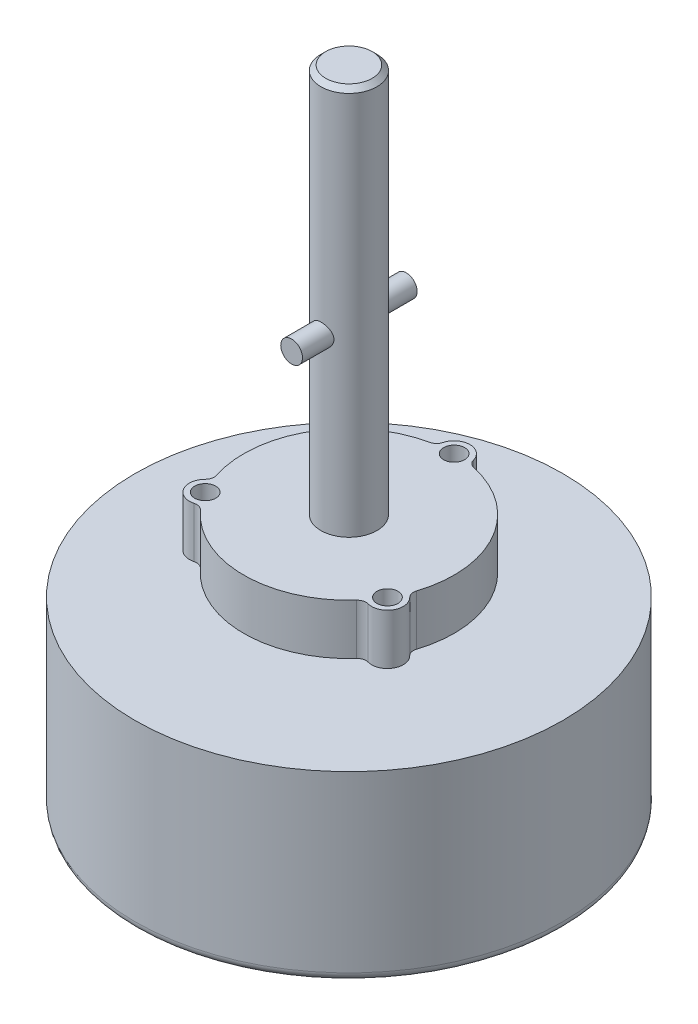
ISO-10303-21;
HEADER;
FILE_DESCRIPTION(('STEP AP214'),'2;1');
FILE_NAME('part.step','',(''),(''),'','','');
FILE_SCHEMA(('AUTOMOTIVE_DESIGN { 1 0 10303 214 1 1 1 1 }'));
ENDSEC;
DATA;
#1=APPLICATION_CONTEXT('core data for automotive mechanical design processes');
#2=APPLICATION_PROTOCOL_DEFINITION('international standard','automotive_design',2000,#1);
#3=PRODUCT_CONTEXT('',#1,'mechanical');
#4=PRODUCT('Part','Part','',(#3));
#5=PRODUCT_RELATED_PRODUCT_CATEGORY('part','',(#4));
#6=PRODUCT_DEFINITION_FORMATION('','',#4);
#7=PRODUCT_DEFINITION_CONTEXT('part definition',#1,'design');
#8=PRODUCT_DEFINITION('design','',#6,#7);
#9=PRODUCT_DEFINITION_SHAPE('','',#8);
#10=(LENGTH_UNIT() NAMED_UNIT(*) SI_UNIT(.MILLI.,.METRE.));
#11=(NAMED_UNIT(*) PLANE_ANGLE_UNIT() SI_UNIT($,.RADIAN.));
#12=(NAMED_UNIT(*) SI_UNIT($,.STERADIAN.) SOLID_ANGLE_UNIT());
#13=UNCERTAINTY_MEASURE_WITH_UNIT(LENGTH_MEASURE(1.E-05),#10,'distance_accuracy_value','');
#14=(GEOMETRIC_REPRESENTATION_CONTEXT(3) GLOBAL_UNCERTAINTY_ASSIGNED_CONTEXT((#13)) GLOBAL_UNIT_ASSIGNED_CONTEXT((#10,
#11,#12)) REPRESENTATION_CONTEXT('',''));
#15=CARTESIAN_POINT('',(0.,0.,0.));
#16=DIRECTION('',(0.,0.,1.));
#17=DIRECTION('',(1.,0.,0.));
#18=AXIS2_PLACEMENT_3D('',#15,#16,#17);
#19=CARTESIAN_POINT('',(0.,91.8,0.));
#20=DIRECTION('',(0.,-1.,0.));
#21=DIRECTION('',(0.,0.,-1.));
#22=AXIS2_PLACEMENT_3D('',#19,#20,#21);
#23=CYLINDRICAL_SURFACE('',#22,4.);
#24=CARTESIAN_POINT('',(0.,91.1095,0.));
#25=DIRECTION('',(0.,-1.,0.));
#26=DIRECTION('',(0.,0.,-1.));
#27=AXIS2_PLACEMENT_3D('',#24,#25,#26);
#28=CIRCLE('',#27,4.);
#29=CARTESIAN_POINT('',(0.,91.1095,-4.));
#30=VERTEX_POINT('',#29);
#31=EDGE_CURVE('E334',#30,#30,#28,.T.);
#32=ORIENTED_EDGE('',*,*,#31,.T.);
#33=EDGE_LOOP('',(#32));
#34=FACE_BOUND('',#33,.T.);
#35=CARTESIAN_POINT('',(0.,36.3,0.));
#36=DIRECTION('',(0.,1.,0.));
#37=DIRECTION('',(0.,0.,1.));
#38=AXIS2_PLACEMENT_3D('',#35,#36,#37);
#39=CIRCLE('',#38,4.);
#40=CARTESIAN_POINT('',(0.,36.3,4.));
#41=VERTEX_POINT('',#40);
#42=EDGE_CURVE('E338',#41,#41,#39,.T.);
#43=ORIENTED_EDGE('',*,*,#42,.T.);
#44=EDGE_LOOP('',(#43));
#45=FACE_BOUND('',#44,.T.);
#46=CARTESIAN_POINT('',(-1.54999999999999,60.5,3.68747881349846));
#47=CARTESIAN_POINT('',(-1.55000422788373,60.416525921829,3.68747472117894));
#48=CARTESIAN_POINT('',(-1.5432346121373,60.3330785285134,3.6903438930156));
#49=CARTESIAN_POINT('',(-1.51646936648417,60.1687131177776,3.70142257969848));
#50=CARTESIAN_POINT('',(-1.49647479481401,60.0877948985202,3.70963166725364));
#51=CARTESIAN_POINT('',(-1.44411451282104,59.9309128219059,3.73032361331672));
#52=CARTESIAN_POINT('',(-1.41178026764899,59.8549369340485,3.74279559342631));
#53=CARTESIAN_POINT('',(-1.33577095631088,59.7094578714103,3.77058994643585));
#54=CARTESIAN_POINT('',(-1.29209225249877,59.6399567825298,3.78591323317096));
#55=CARTESIAN_POINT('',(-1.19214782916111,59.5057059269305,3.81859574425636));
#56=CARTESIAN_POINT('',(-1.13537565240198,59.441348338556,3.83601758351888));
#57=CARTESIAN_POINT('',(-1.01192840493647,59.3227882295189,3.87041383992));
#58=CARTESIAN_POINT('',(-0.945251039434404,59.2685880686878,3.88738815230142));
#59=CARTESIAN_POINT('',(-0.800873934131544,59.1699558673267,3.91972744987039));
#60=CARTESIAN_POINT('',(-0.722859576800982,59.1259551019882,3.9350105551812));
#61=CARTESIAN_POINT('',(-0.559838200580591,59.0518672958997,3.96148780955261));
#62=CARTESIAN_POINT('',(-0.474833798635098,59.0217750757293,3.9726834804112));
#63=CARTESIAN_POINT('',(-0.304371809860816,58.9777490258691,3.9892795157892));
#64=CARTESIAN_POINT('',(-0.219112887243238,58.9631389160219,3.99492158898682));
#65=CARTESIAN_POINT('',(-0.0471791174832273,58.948319587997,4.00064521862469));
#66=CARTESIAN_POINT('',(0.0394952274914372,58.9481053688497,4.00072870605467));
#67=CARTESIAN_POINT('',(0.20693211546229,58.9617014843574,3.99547620694104));
#68=CARTESIAN_POINT('',(0.287765261327417,58.9747723258973,3.99042597894108));
#69=CARTESIAN_POINT('',(0.445987107299915,59.0133167421809,3.97585342004095));
#70=CARTESIAN_POINT('',(0.523375561512841,59.0387912007945,3.96633077044199));
#71=CARTESIAN_POINT('',(0.673879962455661,59.1017366918706,3.94357318810999));
#72=CARTESIAN_POINT('',(0.746915421508994,59.1393802130741,3.93028524095594));
#73=CARTESIAN_POINT('',(0.885818179827671,59.2254383908002,3.90132895999014));
#74=CARTESIAN_POINT('',(0.951683076195868,59.2738566415526,3.88565983241961));
#75=CARTESIAN_POINT('',(1.07871198096843,59.3835974553242,3.85239624089518));
#76=CARTESIAN_POINT('',(1.13933054451892,59.4455343973705,3.83474263937625));
#77=CARTESIAN_POINT('',(1.24953496591409,59.5787830435167,3.80026368534951));
#78=CARTESIAN_POINT('',(1.29911765354162,59.6500974320907,3.7834385719152));
#79=CARTESIAN_POINT('',(1.38698453142152,59.8023691854516,3.75213418417414));
#80=CARTESIAN_POINT('',(1.42495398841721,59.8835236176725,3.73772436806226));
#81=CARTESIAN_POINT('',(1.48647592246951,60.0517811737052,3.71368998675952));
#82=CARTESIAN_POINT('',(1.51003707917727,60.1388806809398,3.70406254129583));
#83=CARTESIAN_POINT('',(1.54079047650637,60.311138786207,3.69137199346917));
#84=CARTESIAN_POINT('',(1.54885502308291,60.3961156535372,3.68795967959354));
#85=CARTESIAN_POINT('',(1.5509166278898,60.5662583663023,3.68709392768971));
#86=CARTESIAN_POINT('',(1.54491755702697,60.6514241532921,3.68963884997596));
#87=CARTESIAN_POINT('',(1.51981486007012,60.8148740203653,3.7000442847608));
#88=CARTESIAN_POINT('',(1.50140958722697,60.8932855607083,3.70762122264295));
#89=CARTESIAN_POINT('',(1.45290900726717,61.0458638649204,3.72689299469388));
#90=CARTESIAN_POINT('',(1.42281120758889,61.1200297198423,3.73858870683515));
#91=CARTESIAN_POINT('',(1.35046181384096,61.2652379582138,3.76534082708802));
#92=CARTESIAN_POINT('',(1.30778133935865,61.3360451188958,3.78051067823169));
#93=CARTESIAN_POINT('',(1.21192549510613,61.469800243298,3.81231998402217));
#94=CARTESIAN_POINT('',(1.15874606517804,61.5327451511026,3.82896000583387));
#95=CARTESIAN_POINT('',(1.03909602838026,61.6534665050848,3.86321173888136));
#96=CARTESIAN_POINT('',(0.971964484409353,61.7105935063539,3.88081192676452));
#97=CARTESIAN_POINT('',(0.828640910393741,61.8128605178356,3.9139183579811));
#98=CARTESIAN_POINT('',(0.752448693612053,61.8580002809337,3.92942455814418));
#99=CARTESIAN_POINT('',(0.593068303299288,61.9347732613715,3.95661272739703));
#100=CARTESIAN_POINT('',(0.50989434345722,61.9664331597324,3.96830224014897));
#101=CARTESIAN_POINT('',(0.338840630357634,62.0151182742924,3.98654841604512));
#102=CARTESIAN_POINT('',(0.250963282170565,62.0321508955935,3.99310767624442));
#103=CARTESIAN_POINT('',(0.0788476448584613,62.0502596375884,4.00009281057401));
#104=CARTESIAN_POINT('',(-0.00528025254627414,62.0522561676002,4.00087242650867));
#105=CARTESIAN_POINT('',(-0.172625822578382,62.0426346913928,3.9971491681954));
#106=CARTESIAN_POINT('',(-0.255843616385901,62.0310185205385,3.9926470060757));
#107=CARTESIAN_POINT('',(-0.416676309706189,61.9951542995088,3.97903546809472));
#108=CARTESIAN_POINT('',(-0.494382292579291,61.9712616027342,3.97005589977893));
#109=CARTESIAN_POINT('',(-0.644679171385821,61.9118858063891,3.94843757966925));
#110=CARTESIAN_POINT('',(-0.717269096200015,61.8764005135019,3.93579813547908));
#111=CARTESIAN_POINT('',(-0.858715328241309,61.7931097823264,3.90743351237822));
#112=CARTESIAN_POINT('',(-0.927274668161894,61.7448381484434,3.89159857716547));
#113=CARTESIAN_POINT('',(-1.05559736841888,61.6380631274072,3.8587703490469));
#114=CARTESIAN_POINT('',(-1.1153574984023,61.5795559997771,3.84177663406475));
#115=CARTESIAN_POINT('',(-1.22791662351865,61.4499978306871,3.8073460300892));
#116=CARTESIAN_POINT('',(-1.28012164141038,61.3784205868488,3.78993942214949));
#117=CARTESIAN_POINT('',(-1.3718088227558,61.226965601563,3.75772676186843));
#118=CARTESIAN_POINT('',(-1.41128794316141,61.1470858808366,3.74292133191169));
#119=CARTESIAN_POINT('',(-1.4785202154391,60.9749879598794,3.71690557840244));
#120=CARTESIAN_POINT('',(-1.50520523660946,60.8822946628194,3.70603717202568));
#121=CARTESIAN_POINT('',(-1.54093566643026,60.6930536008389,3.69132895169951));
#122=CARTESIAN_POINT('',(-1.54999511191143,60.596508965674,3.68748354485378));
#123=CARTESIAN_POINT('',(-1.54999999999999,60.5,3.68747881349846));
#124=B_SPLINE_CURVE_WITH_KNOTS('',3,(#46,#47,#48,#49,#50,#51,#52,#53,#54,#55,#56,#57,#58,#59,
#60,#61,#62,#63,#64,#65,#66,#67,#68,#69,#70,#71,#72,#73,#74,#75,#76,#77,#78,#79,#80,#81,#82,#83,
#84,#85,#86,#87,#88,#89,#90,#91,#92,#93,#94,#95,#96,#97,#98,#99,#100,#101,#102,#103,#104,#105,
#106,#107,#108,#109,#110,#111,#112,#113,#114,#115,#116,#117,#118,#119,#120,#121,#122,#123),
.UNSPECIFIED.,.T.,.F.,(4,2,2,2,2,2,2,2,2,2,2,2,2,2,2,2,2,2,2,2,2,2,2,2,2,2,2,2,2,2,2,2,2,2,2,2,
2,2,4),(0.,0.250062254044811,0.500104500990466,0.749513375495774,0.999002322902403,
1.2605535750421,1.52216551713547,1.79337449738837,2.0644824002558,2.32318673856189,
2.58180120544244,2.82676832941063,3.07175291205883,3.32037458532182,3.56907931835032,
3.83321930090065,4.09743506388207,4.3682807909715,4.63896319774304,4.89390296549874,
5.14877257120582,5.39037605700663,5.63203107506653,5.88312693589144,6.13432009143505,
6.40272092598805,6.67112729313817,6.93899989911214,7.20673681371709,7.45794016491039,
7.70910965090945,7.95338726967235,8.19771113250197,8.45259478665547,8.70757178125691,
8.97713853669457,9.24676970386595,9.53611093061202,9.82522163444681),.UNSPECIFIED.);
#125=CARTESIAN_POINT('',(-1.54999999999999,60.5,3.68747881349846));
#126=VERTEX_POINT('',#125);
#127=EDGE_CURVE('E104',#126,#126,#124,.T.);
#128=ORIENTED_EDGE('',*,*,#127,.F.);
#129=EDGE_LOOP('',(#128));
#130=FACE_BOUND('',#129,.T.);
#131=CARTESIAN_POINT('',(0.,62.05,-4.));
#132=CARTESIAN_POINT('',(0.0837418170105696,62.0500040087332,-4.00000307103966));
#133=CARTESIAN_POINT('',(0.167457172373492,62.0431926629836,-3.9973478314409));
#134=CARTESIAN_POINT('',(0.332375207740034,62.0162464348654,-3.98702237503302));
#135=CARTESIAN_POINT('',(0.413578428549004,61.9961144413173,-3.97935324557983));
#136=CARTESIAN_POINT('',(0.571068953775959,61.9433531193091,-3.95981985493208));
#137=CARTESIAN_POINT('',(0.647365774547914,61.9107488916196,-3.94796402326925));
#138=CARTESIAN_POINT('',(0.793397990414405,61.8341007902612,-3.92122905980691));
#139=CARTESIAN_POINT('',(0.863131499694841,61.7900536423235,-3.9063490629407));
#140=CARTESIAN_POINT('',(0.99718845770088,61.689708587972,-3.8743461117322));
#141=CARTESIAN_POINT('',(1.06117882783834,61.6329870956487,-3.85715676295881));
#142=CARTESIAN_POINT('',(1.17901131840264,61.5098027006004,-3.82278777553389));
#143=CARTESIAN_POINT('',(1.23285001917139,61.4433365286688,-3.80560814209105));
#144=CARTESIAN_POINT('',(1.33104129410195,61.2992114453799,-3.77241707577085));
#145=CARTESIAN_POINT('',(1.37491107737844,61.2212039797822,-3.75648304078581));
#146=CARTESIAN_POINT('',(1.44875905604124,61.0582048622075,-3.7286279787642));
#147=CARTESIAN_POINT('',(1.47874322896953,60.9732162340998,-3.71670522553814));
#148=CARTESIAN_POINT('',(1.52263359505667,60.8025108139888,-3.69893619719525));
#149=CARTESIAN_POINT('',(1.53717845025293,60.7169841183488,-3.69284964987085));
#150=CARTESIAN_POINT('',(1.55177347407325,60.5445039614294,-3.686742208991));
#151=CARTESIAN_POINT('',(1.5518301622529,60.4575511595025,-3.68671858716909));
#152=CARTESIAN_POINT('',(1.53793335557095,60.2906718049964,-3.69253360906917));
#153=CARTESIAN_POINT('',(1.52488463668499,60.210654211058,-3.69799366796117));
#154=CARTESIAN_POINT('',(1.48664952044109,60.0540485556512,-3.71352858031643));
#155=CARTESIAN_POINT('',(1.46146116614317,59.977461049298,-3.72360417780325));
#156=CARTESIAN_POINT('',(1.39919376657938,59.8281119087605,-3.74745019933858));
#157=CARTESIAN_POINT('',(1.36189037494606,59.7554552886887,-3.76128946343745));
#158=CARTESIAN_POINT('',(1.2766086785549,59.6171778970109,-3.7910825309682));
#159=CARTESIAN_POINT('',(1.22862651830681,59.5515596792803,-3.80703709727107));
#160=CARTESIAN_POINT('',(1.11927658672492,59.4242405150003,-3.84066621512757));
#161=CARTESIAN_POINT('',(1.05719282693902,59.3631637700317,-3.85838181074213));
#162=CARTESIAN_POINT('',(0.923467184299255,59.2520960092834,-3.89255270828943));
#163=CARTESIAN_POINT('',(0.851823630229701,59.2021069358957,-3.90900778906909));
#164=CARTESIAN_POINT('',(0.699332321527998,59.1138816283324,-3.93917140871768));
#165=CARTESIAN_POINT('',(0.618345361125583,59.0758665254086,-3.95282680746144));
#166=CARTESIAN_POINT('',(0.450463577524217,59.0142112313996,-3.97545468791428));
#167=CARTESIAN_POINT('',(0.363571585538878,58.9905642047417,-3.98442939616062));
#168=CARTESIAN_POINT('',(0.191589310536455,58.9595469993797,-3.99628616226532));
#169=CARTESIAN_POINT('',(0.106672001209189,58.9513371145585,-3.99948214473611));
#170=CARTESIAN_POINT('',(-0.0633780229217553,58.9489652173741,-4.0004007065522));
#171=CARTESIAN_POINT('',(-0.148510681164285,58.9547998354968,-3.99812459874478));
#172=CARTESIAN_POINT('',(-0.312858974622353,58.9797230318359,-3.98856115851297));
#173=CARTESIAN_POINT('',(-0.392173433269943,58.9982501769955,-3.98148622105735));
#174=CARTESIAN_POINT('',(-0.54650371536321,59.0472811378791,-3.96325324682585));
#175=CARTESIAN_POINT('',(-0.621518980627415,59.0777865047648,-3.95209468123897));
#176=CARTESIAN_POINT('',(-0.767652849526804,59.1508947509368,-3.92637006174119));
#177=CARTESIAN_POINT('',(-0.838586587400785,59.1938336532552,-3.91171167856456));
#178=CARTESIAN_POINT('',(-0.972485884255139,59.2902139412909,-3.88059327622918));
#179=CARTESIAN_POINT('',(-1.03544835343257,59.3436593791585,-3.86413256303816));
#180=CARTESIAN_POINT('',(-1.15570630052788,59.4634276968011,-3.82994670072776));
#181=CARTESIAN_POINT('',(-1.21240855982171,59.5303434582915,-3.81220642219352));
#182=CARTESIAN_POINT('',(-1.3139104284201,59.6730730146664,-3.7784267775271));
#183=CARTESIAN_POINT('',(-1.35870855493064,59.7488879163451,-3.76238762343854));
#184=CARTESIAN_POINT('',(-1.43528626427411,59.9081328444692,-3.73385097634257));
#185=CARTESIAN_POINT('',(-1.46697619056478,59.991610692979,-3.72137804867912));
#186=CARTESIAN_POINT('',(-1.51562246992129,60.1633418253857,-3.70183589219826));
#187=CARTESIAN_POINT('',(-1.53258879385556,60.2515918344707,-3.69476300684656));
#188=CARTESIAN_POINT('',(-1.55038415337444,60.4238860559088,-3.68732874278393));
#189=CARTESIAN_POINT('',(-1.55223359693948,60.5078073337269,-3.68654305278754));
#190=CARTESIAN_POINT('',(-1.54238929517269,60.6747006279681,-3.69067248938599));
#191=CARTESIAN_POINT('',(-1.53069702502093,60.7576727467947,-3.69558699502441));
#192=CARTESIAN_POINT('',(-1.49491544189353,60.9173658961104,-3.71019928004619));
#193=CARTESIAN_POINT('',(-1.47127191862499,60.9942039895687,-3.7197245672776));
#194=CARTESIAN_POINT('',(-1.41266354169454,61.1428607679701,-3.74237408260303));
#195=CARTESIAN_POINT('',(-1.37769573935542,61.214678139662,-3.7554992479164));
#196=CARTESIAN_POINT('',(-1.29520837732455,61.3555456155642,-3.7847652300439));
#197=CARTESIAN_POINT('',(-1.24710518862183,61.4242274230726,-3.80103203424639));
#198=CARTESIAN_POINT('',(-1.1405907131212,61.5528684986922,-3.83434014261162));
#199=CARTESIAN_POINT('',(-1.08217604027141,61.6128248897439,-3.85138169981625));
#200=CARTESIAN_POINT('',(-0.952559682216139,61.7259513973311,-3.88553398671661));
#201=CARTESIAN_POINT('',(-0.880804909103497,61.778507699511,-3.90258881429735));
#202=CARTESIAN_POINT('',(-0.728878495223066,61.8708166177628,-3.93379551376096));
#203=CARTESIAN_POINT('',(-0.648705209225498,61.9105667249222,-3.94794681660584));
#204=CARTESIAN_POINT('',(-0.476070144268094,61.978190879095,-3.97259068830064));
#205=CARTESIAN_POINT('',(-0.383139212843741,62.0050038021252,-3.98274647341979));
#206=CARTESIAN_POINT('',(-0.19345888362943,62.0409007680691,-3.99644738728565));
#207=CARTESIAN_POINT('',(-0.0967117952157216,62.0499953703921,-3.99999645331605));
#208=CARTESIAN_POINT('',(0.,62.05,-4.));
#209=B_SPLINE_CURVE_WITH_KNOTS('',3,(#131,#132,#133,#134,#135,#136,#137,#138,#139,#140,#141,
#142,#143,#144,#145,#146,#147,#148,#149,#150,#151,#152,#153,#154,#155,#156,#157,#158,#159,#160,
#161,#162,#163,#164,#165,#166,#167,#168,#169,#170,#171,#172,#173,#174,#175,#176,#177,#178,#179,
#180,#181,#182,#183,#184,#185,#186,#187,#188,#189,#190,#191,#192,#193,#194,#195,#196,#197,#198,
#199,#200,#201,#202,#203,#204,#205,#206,#207,#208),.UNSPECIFIED.,.T.,.F.,(4,2,2,2,2,2,2,2,2,2,2,
2,2,2,2,2,2,2,2,2,2,2,2,2,2,2,2,2,2,2,2,2,2,2,2,2,2,2,4),(0.,0.250868506659483,
0.501682625822806,0.751994606804862,1.00237829091529,1.26289324584923,1.52349580083107,
1.79484593304449,2.06607914435899,2.32559405583377,2.58499218753426,2.82763403872308,
3.07031501748277,3.31777403042843,3.5653225319728,3.83073141369119,4.09618675436141,
4.36629046146056,4.63626556664625,4.89107530662836,5.14582391953313,5.3899755248779,
5.63415875792247,5.88568062986169,6.1372996995035,6.4045161155511,6.67176580083182,
6.94081432578585,7.20968050775752,7.46023414456832,7.71076048963595,7.95256448228419,
8.19443148785929,8.4495750720616,8.70480259588004,8.97517525206182,9.24560084585602,
9.53549682269167,9.82521998022793),.UNSPECIFIED.);
#210=CARTESIAN_POINT('',(0.,62.05,-4.));
#211=VERTEX_POINT('',#210);
#212=EDGE_CURVE('E12',#211,#211,#209,.T.);
#213=ORIENTED_EDGE('',*,*,#212,.F.);
#214=EDGE_LOOP('',(#213));
#215=FACE_BOUND('',#214,.T.);
#216=ADVANCED_FACE('F91',(#34,#45,#130,#215),#23,.T.);
#217=CARTESIAN_POINT('',(0.,36.3,0.));
#218=DIRECTION('',(0.,1.,0.));
#219=DIRECTION('',(0.,0.,1.));
#220=AXIS2_PLACEMENT_3D('',#217,#218,#219);
#221=PLANE('',#220);
#222=ORIENTED_EDGE('',*,*,#42,.F.);
#223=EDGE_LOOP('',(#222));
#224=FACE_BOUND('',#223,.T.);
#225=CARTESIAN_POINT('',(0.,36.3,-15.));
#226=DIRECTION('',(0.,1.,0.));
#227=DIRECTION('',(0.,0.,1.));
#228=AXIS2_PLACEMENT_3D('',#225,#226,#227);
#229=CIRCLE('',#228,1.5);
#230=CARTESIAN_POINT('',(0.,36.3,-13.5));
#231=VERTEX_POINT('',#230);
#232=EDGE_CURVE('E363',#231,#231,#229,.T.);
#233=ORIENTED_EDGE('',*,*,#232,.F.);
#234=EDGE_LOOP('',(#233));
#235=FACE_BOUND('',#234,.T.);
#236=CARTESIAN_POINT('',(12.9903810567665,36.3,7.50000000000006));
#237=DIRECTION('',(0.,1.,0.));
#238=DIRECTION('',(0.,0.,1.));
#239=AXIS2_PLACEMENT_3D('',#236,#237,#238);
#240=CIRCLE('',#239,1.5);
#241=CARTESIAN_POINT('',(12.9903810567665,36.3,9.00000000000006));
#242=VERTEX_POINT('',#241);
#243=EDGE_CURVE('E370',#242,#242,#240,.T.);
#244=ORIENTED_EDGE('',*,*,#243,.F.);
#245=EDGE_LOOP('',(#244));
#246=FACE_BOUND('',#245,.T.);
#247=CARTESIAN_POINT('',(-12.9903810567665,36.3,7.50000000000006));
#248=DIRECTION('',(0.,1.,0.));
#249=DIRECTION('',(0.,0.,1.));
#250=AXIS2_PLACEMENT_3D('',#247,#248,#249);
#251=CIRCLE('',#250,1.5);
#252=CARTESIAN_POINT('',(-12.9903810567665,36.3,9.00000000000006));
#253=VERTEX_POINT('',#252);
#254=EDGE_CURVE('E356',#253,#253,#251,.T.);
#255=ORIENTED_EDGE('',*,*,#254,.F.);
#256=EDGE_LOOP('',(#255));
#257=FACE_BOUND('',#256,.T.);
#258=CARTESIAN_POINT('',(0.,36.3,0.));
#259=DIRECTION('',(0.,1.,0.));
#260=DIRECTION('',(0.,0.,1.));
#261=AXIS2_PLACEMENT_3D('',#258,#259,#260);
#262=CIRCLE('',#261,15.);
#263=CARTESIAN_POINT('',(11.1437624916875,36.3,10.0407448692245));
#264=VERTEX_POINT('',#263);
#265=CARTESIAN_POINT('',(-11.1437624916875,36.3,10.0407448692245));
#266=VERTEX_POINT('',#265);
#267=EDGE_CURVE('E219',#264,#266,#262,.F.);
#268=ORIENTED_EDGE('',*,*,#267,.F.);
#269=CARTESIAN_POINT('',(12.0724093659948,36.3,10.8774736083265));
#270=DIRECTION('',(0.,1.,0.));
#271=DIRECTION('',(0.,0.,1.));
#272=AXIS2_PLACEMENT_3D('',#269,#270,#271);
#273=CIRCLE('',#272,1.25);
#274=CARTESIAN_POINT('',(12.4002563984133,36.3,9.67123303392421));
#275=VERTEX_POINT('',#274);
#276=EDGE_CURVE('E283',#264,#275,#273,.F.);
#277=ORIENTED_EDGE('',*,*,#276,.T.);
#278=CARTESIAN_POINT('',(12.9903810567665,36.3,7.50000000000006));
#279=DIRECTION('',(0.,1.,0.));
#280=DIRECTION('',(0.,0.,1.));
#281=AXIS2_PLACEMENT_3D('',#278,#279,#280);
#282=CIRCLE('',#281,2.25);
#283=CARTESIAN_POINT('',(14.5756616925042,36.3,5.90332053750449));
#284=VERTEX_POINT('',#283);
#285=EDGE_CURVE('E213',#275,#284,#282,.T.);
#286=ORIENTED_EDGE('',*,*,#285,.T.);
#287=CARTESIAN_POINT('',(15.4563731568029,36.3,5.01627639167362));
#288=DIRECTION('',(0.,1.,0.));
#289=DIRECTION('',(0.,0.,1.));
#290=AXIS2_PLACEMENT_3D('',#287,#288,#289);
#291=CIRCLE('',#290,1.25);
#292=CARTESIAN_POINT('',(14.2674213755104,36.3,4.63040897692949));
#293=VERTEX_POINT('',#292);
#294=EDGE_CURVE('E212',#284,#293,#291,.F.);
#295=ORIENTED_EDGE('',*,*,#294,.T.);
#296=CARTESIAN_POINT('',(0.,36.3,0.));
#297=DIRECTION('',(0.,1.,0.));
#298=DIRECTION('',(0.,0.,1.));
#299=AXIS2_PLACEMENT_3D('',#296,#297,#298);
#300=CIRCLE('',#299,15.);
#301=CARTESIAN_POINT('',(3.12365888382282,36.3,-14.6711538461538));
#302=VERTEX_POINT('',#301);
#303=EDGE_CURVE('E202',#302,#293,#300,.F.);
#304=ORIENTED_EDGE('',*,*,#303,.F.);
#305=CARTESIAN_POINT('',(3.38396379080805,36.3,-15.89375));
#306=DIRECTION('',(0.,1.,0.));
#307=DIRECTION('',(0.,0.,1.));
#308=AXIS2_PLACEMENT_3D('',#305,#306,#307);
#309=CIRCLE('',#308,1.25);
#310=CARTESIAN_POINT('',(2.17540529409089,36.3,-15.5745535714286));
#311=VERTEX_POINT('',#310);
#312=EDGE_CURVE('E187',#302,#311,#309,.F.);
#313=ORIENTED_EDGE('',*,*,#312,.T.);
#314=CARTESIAN_POINT('',(0.,36.3,-15.));
#315=DIRECTION('',(0.,1.,0.));
#316=DIRECTION('',(0.,0.,1.));
#317=AXIS2_PLACEMENT_3D('',#314,#315,#316);
#318=CIRCLE('',#317,2.25);
#319=CARTESIAN_POINT('',(-2.17540529409089,36.3,-15.5745535714286));
#320=VERTEX_POINT('',#319);
#321=EDGE_CURVE('E228',#311,#320,#318,.T.);
#322=ORIENTED_EDGE('',*,*,#321,.T.);
#323=CARTESIAN_POINT('',(-3.38396379080805,36.3,-15.89375));
#324=DIRECTION('',(0.,1.,0.));
#325=DIRECTION('',(0.,0.,1.));
#326=AXIS2_PLACEMENT_3D('',#323,#324,#325);
#327=CIRCLE('',#326,1.25);
#328=CARTESIAN_POINT('',(-3.12365888382281,36.3,-14.6711538461538));
#329=VERTEX_POINT('',#328);
#330=EDGE_CURVE('E119',#320,#329,#327,.F.);
#331=ORIENTED_EDGE('',*,*,#330,.T.);
#332=CARTESIAN_POINT('',(0.,36.3,0.));
#333=DIRECTION('',(0.,1.,0.));
#334=DIRECTION('',(0.,0.,1.));
#335=AXIS2_PLACEMENT_3D('',#332,#333,#334);
#336=CIRCLE('',#335,15.);
#337=CARTESIAN_POINT('',(-14.2674213755104,36.3,4.63040897692949));
#338=VERTEX_POINT('',#337);
#339=EDGE_CURVE('E226',#329,#338,#336,.T.);
#340=ORIENTED_EDGE('',*,*,#339,.T.);
#341=CARTESIAN_POINT('',(-15.4563731568029,36.3,5.01627639167362));
#342=DIRECTION('',(0.,1.,0.));
#343=DIRECTION('',(0.,0.,1.));
#344=AXIS2_PLACEMENT_3D('',#341,#342,#343);
#345=CIRCLE('',#344,1.25);
#346=CARTESIAN_POINT('',(-14.5756616925042,36.3,5.90332053750449));
#347=VERTEX_POINT('',#346);
#348=EDGE_CURVE('E111',#338,#347,#345,.F.);
#349=ORIENTED_EDGE('',*,*,#348,.T.);
#350=CARTESIAN_POINT('',(-12.9903810567665,36.3,7.50000000000006));
#351=DIRECTION('',(0.,1.,0.));
#352=DIRECTION('',(0.,0.,1.));
#353=AXIS2_PLACEMENT_3D('',#350,#351,#352);
#354=CIRCLE('',#353,2.25);
#355=CARTESIAN_POINT('',(-12.4002563984133,36.3,9.67123303392421));
#356=VERTEX_POINT('',#355);
#357=EDGE_CURVE('E230',#347,#356,#354,.T.);
#358=ORIENTED_EDGE('',*,*,#357,.T.);
#359=CARTESIAN_POINT('',(-12.0724093659948,36.3,10.8774736083265));
#360=DIRECTION('',(0.,1.,0.));
#361=DIRECTION('',(0.,0.,1.));
#362=AXIS2_PLACEMENT_3D('',#359,#360,#361);
#363=CIRCLE('',#362,1.25);
#364=EDGE_CURVE('E287',#356,#266,#363,.F.);
#365=ORIENTED_EDGE('',*,*,#364,.T.);
#366=EDGE_LOOP('',(#268,#277,#286,#295,#304,#313,#322,#331,#340,#349,#358,#365));
#367=FACE_BOUND('',#366,.T.);
#368=ADVANCED_FACE('F210',(#224,#235,#246,#257,#367),#221,.T.);
#369=CARTESIAN_POINT('',(0.,29.1,0.));
#370=DIRECTION('',(0.,1.,0.));
#371=DIRECTION('',(0.,0.,1.));
#372=AXIS2_PLACEMENT_3D('',#369,#370,#371);
#373=PLANE('',#372);
#374=CARTESIAN_POINT('',(0.,29.1,-15.));
#375=DIRECTION('',(0.,1.,0.));
#376=DIRECTION('',(0.,0.,1.));
#377=AXIS2_PLACEMENT_3D('',#374,#375,#376);
#378=CIRCLE('',#377,1.5);
#379=CARTESIAN_POINT('',(0.,29.1,-13.5));
#380=VERTEX_POINT('',#379);
#381=EDGE_CURVE('E366',#380,#380,#378,.F.);
#382=ORIENTED_EDGE('',*,*,#381,.F.);
#383=EDGE_LOOP('',(#382));
#384=FACE_BOUND('',#383,.T.);
#385=CARTESIAN_POINT('',(12.9903810567665,29.1,7.50000000000006));
#386=DIRECTION('',(0.,1.,0.));
#387=DIRECTION('',(0.,0.,1.));
#388=AXIS2_PLACEMENT_3D('',#385,#386,#387);
#389=CIRCLE('',#388,1.5);
#390=CARTESIAN_POINT('',(12.9903810567665,29.1,9.00000000000006));
#391=VERTEX_POINT('',#390);
#392=EDGE_CURVE('E367',#391,#391,#389,.F.);
#393=ORIENTED_EDGE('',*,*,#392,.F.);
#394=EDGE_LOOP('',(#393));
#395=FACE_BOUND('',#394,.T.);
#396=CARTESIAN_POINT('',(-12.9903810567665,29.1,7.50000000000006));
#397=DIRECTION('',(0.,1.,0.));
#398=DIRECTION('',(0.,0.,1.));
#399=AXIS2_PLACEMENT_3D('',#396,#397,#398);
#400=CIRCLE('',#399,1.5);
#401=CARTESIAN_POINT('',(-12.9903810567665,29.1,9.00000000000006));
#402=VERTEX_POINT('',#401);
#403=EDGE_CURVE('E373',#402,#402,#400,.F.);
#404=ORIENTED_EDGE('',*,*,#403,.F.);
#405=EDGE_LOOP('',(#404));
#406=FACE_BOUND('',#405,.T.);
#407=CARTESIAN_POINT('',(12.9903810567665,29.1,7.50000000000006));
#408=DIRECTION('',(0.,1.,0.));
#409=DIRECTION('',(0.,0.,1.));
#410=AXIS2_PLACEMENT_3D('',#407,#408,#409);
#411=CIRCLE('',#410,2.25);
#412=CARTESIAN_POINT('',(12.4002563984133,29.1,9.67123303392421));
#413=VERTEX_POINT('',#412);
#414=CARTESIAN_POINT('',(14.5756616925042,29.1,5.90332053750449));
#415=VERTEX_POINT('',#414);
#416=EDGE_CURVE('E216',#413,#415,#411,.T.);
#417=ORIENTED_EDGE('',*,*,#416,.F.);
#418=CARTESIAN_POINT('',(12.0724093659948,29.1,10.8774736083265));
#419=DIRECTION('',(0.,1.,0.));
#420=DIRECTION('',(0.,0.,1.));
#421=AXIS2_PLACEMENT_3D('',#418,#419,#420);
#422=CIRCLE('',#421,1.25);
#423=CARTESIAN_POINT('',(11.1437624916875,29.1,10.0407448692245));
#424=VERTEX_POINT('',#423);
#425=EDGE_CURVE('E285',#413,#424,#422,.T.);
#426=ORIENTED_EDGE('',*,*,#425,.T.);
#427=CARTESIAN_POINT('',(0.,29.1,0.));
#428=DIRECTION('',(0.,1.,0.));
#429=DIRECTION('',(0.,0.,1.));
#430=AXIS2_PLACEMENT_3D('',#427,#428,#429);
#431=CIRCLE('',#430,15.);
#432=CARTESIAN_POINT('',(-11.1437624916875,29.1,10.0407448692245));
#433=VERTEX_POINT('',#432);
#434=EDGE_CURVE('E214',#424,#433,#431,.F.);
#435=ORIENTED_EDGE('',*,*,#434,.T.);
#436=CARTESIAN_POINT('',(-12.0724093659948,29.1,10.8774736083265));
#437=DIRECTION('',(0.,1.,0.));
#438=DIRECTION('',(0.,0.,1.));
#439=AXIS2_PLACEMENT_3D('',#436,#437,#438);
#440=CIRCLE('',#439,1.25);
#441=CARTESIAN_POINT('',(-12.4002563984133,29.1,9.67123303392421));
#442=VERTEX_POINT('',#441);
#443=EDGE_CURVE('E289',#433,#442,#440,.T.);
#444=ORIENTED_EDGE('',*,*,#443,.T.);
#445=CARTESIAN_POINT('',(-12.9903810567665,29.1,7.50000000000006));
#446=DIRECTION('',(0.,1.,0.));
#447=DIRECTION('',(0.,0.,1.));
#448=AXIS2_PLACEMENT_3D('',#445,#446,#447);
#449=CIRCLE('',#448,2.25);
#450=CARTESIAN_POINT('',(-14.5756616925042,29.1,5.90332053750449));
#451=VERTEX_POINT('',#450);
#452=EDGE_CURVE('E245',#451,#442,#449,.T.);
#453=ORIENTED_EDGE('',*,*,#452,.F.);
#454=CARTESIAN_POINT('',(-15.4563731568029,29.1,5.01627639167362));
#455=DIRECTION('',(0.,1.,0.));
#456=DIRECTION('',(0.,0.,1.));
#457=AXIS2_PLACEMENT_3D('',#454,#455,#456);
#458=CIRCLE('',#457,1.25);
#459=CARTESIAN_POINT('',(-14.2674213755104,29.1,4.63040897692949));
#460=VERTEX_POINT('',#459);
#461=EDGE_CURVE('E292',#451,#460,#458,.T.);
#462=ORIENTED_EDGE('',*,*,#461,.T.);
#463=CARTESIAN_POINT('',(0.,29.1,0.));
#464=DIRECTION('',(0.,1.,0.));
#465=DIRECTION('',(0.,0.,1.));
#466=AXIS2_PLACEMENT_3D('',#463,#464,#465);
#467=CIRCLE('',#466,15.);
#468=CARTESIAN_POINT('',(-3.12365888382281,29.1,-14.6711538461538));
#469=VERTEX_POINT('',#468);
#470=EDGE_CURVE('E240',#469,#460,#467,.T.);
#471=ORIENTED_EDGE('',*,*,#470,.F.);
#472=CARTESIAN_POINT('',(-3.38396379080805,29.1,-15.89375));
#473=DIRECTION('',(0.,1.,0.));
#474=DIRECTION('',(0.,0.,1.));
#475=AXIS2_PLACEMENT_3D('',#472,#473,#474);
#476=CIRCLE('',#475,1.25);
#477=CARTESIAN_POINT('',(-2.17540529409089,29.1,-15.5745535714286));
#478=VERTEX_POINT('',#477);
#479=EDGE_CURVE('E295',#469,#478,#476,.T.);
#480=ORIENTED_EDGE('',*,*,#479,.T.);
#481=CARTESIAN_POINT('',(0.,29.1,-15.));
#482=DIRECTION('',(0.,1.,0.));
#483=DIRECTION('',(0.,0.,1.));
#484=AXIS2_PLACEMENT_3D('',#481,#482,#483);
#485=CIRCLE('',#484,2.25);
#486=CARTESIAN_POINT('',(2.17540529409089,29.1,-15.5745535714286));
#487=VERTEX_POINT('',#486);
#488=EDGE_CURVE('E248',#487,#478,#485,.T.);
#489=ORIENTED_EDGE('',*,*,#488,.F.);
#490=CARTESIAN_POINT('',(3.38396379080805,29.1,-15.89375));
#491=DIRECTION('',(0.,1.,0.));
#492=DIRECTION('',(0.,0.,1.));
#493=AXIS2_PLACEMENT_3D('',#490,#491,#492);
#494=CIRCLE('',#493,1.25);
#495=CARTESIAN_POINT('',(3.12365888382282,29.1,-14.6711538461538));
#496=VERTEX_POINT('',#495);
#497=EDGE_CURVE('E195',#487,#496,#494,.T.);
#498=ORIENTED_EDGE('',*,*,#497,.T.);
#499=CARTESIAN_POINT('',(0.,29.1,0.));
#500=DIRECTION('',(0.,1.,0.));
#501=DIRECTION('',(0.,0.,1.));
#502=AXIS2_PLACEMENT_3D('',#499,#500,#501);
#503=CIRCLE('',#502,15.);
#504=CARTESIAN_POINT('',(14.2674213755104,29.1,4.63040897692949));
#505=VERTEX_POINT('',#504);
#506=EDGE_CURVE('E205',#496,#505,#503,.F.);
#507=ORIENTED_EDGE('',*,*,#506,.T.);
#508=CARTESIAN_POINT('',(15.4563731568029,29.1,5.01627639167362));
#509=DIRECTION('',(0.,1.,0.));
#510=DIRECTION('',(0.,0.,1.));
#511=AXIS2_PLACEMENT_3D('',#508,#509,#510);
#512=CIRCLE('',#511,1.25);
#513=EDGE_CURVE('E281',#505,#415,#512,.T.);
#514=ORIENTED_EDGE('',*,*,#513,.T.);
#515=EDGE_LOOP('',(#417,#426,#435,#444,#453,#462,#471,#480,#489,#498,#507,#514));
#516=FACE_BOUND('',#515,.T.);
#517=CARTESIAN_POINT('',(0.,29.1,0.));
#518=DIRECTION('',(0.,1.,0.));
#519=DIRECTION('',(0.,0.,1.));
#520=AXIS2_PLACEMENT_3D('',#517,#518,#519);
#521=CIRCLE('',#520,10.25);
#522=CARTESIAN_POINT('',(0.,29.1,10.25));
#523=VERTEX_POINT('',#522);
#524=EDGE_CURVE('E233',#523,#523,#521,.T.);
#525=ORIENTED_EDGE('',*,*,#524,.T.);
#526=EDGE_LOOP('',(#525));
#527=FACE_BOUND('',#526,.T.);
#528=ADVANCED_FACE('F328',(#384,#395,#406,#516,#527),#373,.F.);
#529=CARTESIAN_POINT('',(0.,26.1,0.));
#530=DIRECTION('',(0.,-1.,0.));
#531=DIRECTION('',(0.,0.,-1.));
#532=AXIS2_PLACEMENT_3D('',#529,#530,#531);
#533=CYLINDRICAL_SURFACE('',#532,30.5);
#534=CARTESIAN_POINT('',(0.,1.25,0.));
#535=DIRECTION('',(0.,1.,0.));
#536=DIRECTION('',(0.,0.,1.));
#537=AXIS2_PLACEMENT_3D('',#534,#535,#536);
#538=CIRCLE('',#537,30.5);
#539=CARTESIAN_POINT('',(0.,1.25,30.5));
#540=VERTEX_POINT('',#539);
#541=EDGE_CURVE('E274',#540,#540,#538,.T.);
#542=ORIENTED_EDGE('',*,*,#541,.T.);
#543=EDGE_LOOP('',(#542));
#544=FACE_BOUND('',#543,.T.);
#545=CARTESIAN_POINT('',(0.,26.1,0.));
#546=DIRECTION('',(0.,1.,0.));
#547=DIRECTION('',(0.,0.,1.));
#548=AXIS2_PLACEMENT_3D('',#545,#546,#547);
#549=CIRCLE('',#548,30.5);
#550=CARTESIAN_POINT('',(0.,26.1,30.5));
#551=VERTEX_POINT('',#550);
#552=EDGE_CURVE('E236',#551,#551,#549,.T.);
#553=ORIENTED_EDGE('',*,*,#552,.F.);
#554=EDGE_LOOP('',(#553));
#555=FACE_BOUND('',#554,.T.);
#556=ADVANCED_FACE('F426',(#544,#555),#533,.T.);
#557=CARTESIAN_POINT('',(0.,26.1,0.));
#558=DIRECTION('',(0.,1.,0.));
#559=DIRECTION('',(0.,0.,1.));
#560=AXIS2_PLACEMENT_3D('',#557,#558,#559);
#561=PLANE('',#560);
#562=CARTESIAN_POINT('',(0.,26.1,0.));
#563=DIRECTION('',(0.,1.,0.));
#564=DIRECTION('',(0.,0.,1.));
#565=AXIS2_PLACEMENT_3D('',#562,#563,#564);
#566=CIRCLE('',#565,10.25);
#567=CARTESIAN_POINT('',(0.,26.1,10.25));
#568=VERTEX_POINT('',#567);
#569=EDGE_CURVE('E237',#568,#568,#566,.T.);
#570=ORIENTED_EDGE('',*,*,#569,.F.);
#571=EDGE_LOOP('',(#570));
#572=FACE_BOUND('',#571,.T.);
#573=ORIENTED_EDGE('',*,*,#552,.T.);
#574=EDGE_LOOP('',(#573));
#575=FACE_BOUND('',#574,.T.);
#576=ADVANCED_FACE('F429',(#572,#575),#561,.T.);
#577=CARTESIAN_POINT('',(0.,0.,0.));
#578=DIRECTION('',(0.,1.,0.));
#579=DIRECTION('',(0.,0.,1.));
#580=AXIS2_PLACEMENT_3D('',#577,#578,#579);
#581=PLANE('',#580);
#582=CARTESIAN_POINT('',(0.,0.,0.));
#583=DIRECTION('',(0.,1.,0.));
#584=DIRECTION('',(0.,0.,1.));
#585=AXIS2_PLACEMENT_3D('',#582,#583,#584);
#586=CIRCLE('',#585,29.25);
#587=CARTESIAN_POINT('',(0.,0.,29.25));
#588=VERTEX_POINT('',#587);
#589=EDGE_CURVE('E196',#588,#588,#586,.F.);
#590=ORIENTED_EDGE('',*,*,#589,.T.);
#591=EDGE_LOOP('',(#590));
#592=FACE_BOUND('',#591,.T.);
#593=ADVANCED_FACE('F418',(#592),#581,.F.);
#594=CARTESIAN_POINT('',(0.,29.1,0.));
#595=DIRECTION('',(0.,-1.,0.));
#596=DIRECTION('',(0.,0.,-1.));
#597=AXIS2_PLACEMENT_3D('',#594,#595,#596);
#598=CYLINDRICAL_SURFACE('',#597,10.25);
#599=ORIENTED_EDGE('',*,*,#524,.F.);
#600=EDGE_LOOP('',(#599));
#601=FACE_BOUND('',#600,.T.);
#602=ORIENTED_EDGE('',*,*,#569,.T.);
#603=EDGE_LOOP('',(#602));
#604=FACE_BOUND('',#603,.T.);
#605=ADVANCED_FACE('F410',(#601,#604),#598,.T.);
#606=CARTESIAN_POINT('',(0.,-4.99787975087696,-15.));
#607=DIRECTION('',(0.,1.,0.));
#608=DIRECTION('',(0.,0.,1.));
#609=AXIS2_PLACEMENT_3D('',#606,#607,#608);
#610=CYLINDRICAL_SURFACE('',#609,2.25);
#611=ORIENTED_EDGE('',*,*,#321,.F.);
#612=DIRECTION('',(0.,1.,0.));
#613=VECTOR('',#612,1.);
#614=CARTESIAN_POINT('',(2.17540529409089,-4.99787975087696,-15.5745535714286));
#615=LINE('',#614,#613);
#616=EDGE_CURVE('E192',#311,#487,#615,.F.);
#617=ORIENTED_EDGE('',*,*,#616,.T.);
#618=ORIENTED_EDGE('',*,*,#488,.T.);
#619=DIRECTION('',(0.,1.,0.));
#620=VECTOR('',#619,1.);
#621=CARTESIAN_POINT('',(-2.17540529409089,-4.99787975087696,-15.5745535714286));
#622=LINE('',#621,#620);
#623=EDGE_CURVE('E206',#478,#320,#622,.T.);
#624=ORIENTED_EDGE('',*,*,#623,.T.);
#625=EDGE_LOOP('',(#611,#617,#618,#624));
#626=FACE_BOUND('',#625,.T.);
#627=ADVANCED_FACE('F408',(#626),#610,.T.);
#628=CARTESIAN_POINT('',(-12.9903810567665,-4.99787975087696,7.50000000000006));
#629=DIRECTION('',(0.,1.,0.));
#630=DIRECTION('',(0.,0.,1.));
#631=AXIS2_PLACEMENT_3D('',#628,#629,#630);
#632=CYLINDRICAL_SURFACE('',#631,2.25);
#633=ORIENTED_EDGE('',*,*,#452,.T.);
#634=DIRECTION('',(0.,1.,0.));
#635=VECTOR('',#634,1.);
#636=CARTESIAN_POINT('',(-12.4002563984133,-4.99787975087696,9.67123303392421));
#637=LINE('',#636,#635);
#638=EDGE_CURVE('E267',#442,#356,#637,.T.);
#639=ORIENTED_EDGE('',*,*,#638,.T.);
#640=ORIENTED_EDGE('',*,*,#357,.F.);
#641=DIRECTION('',(0.,1.,0.));
#642=VECTOR('',#641,1.);
#643=CARTESIAN_POINT('',(-14.5756616925042,-4.99787975087696,5.90332053750449));
#644=LINE('',#643,#642);
#645=EDGE_CURVE('E265',#347,#451,#644,.F.);
#646=ORIENTED_EDGE('',*,*,#645,.T.);
#647=EDGE_LOOP('',(#633,#639,#640,#646));
#648=FACE_BOUND('',#647,.T.);
#649=ADVANCED_FACE('F395',(#648),#632,.T.);
#650=CARTESIAN_POINT('',(0.,-4.99787975087696,0.));
#651=DIRECTION('',(0.,1.,0.));
#652=DIRECTION('',(0.,0.,1.));
#653=AXIS2_PLACEMENT_3D('',#650,#651,#652);
#654=CYLINDRICAL_SURFACE('',#653,15.);
#655=ORIENTED_EDGE('',*,*,#470,.T.);
#656=DIRECTION('',(0.,1.,0.));
#657=VECTOR('',#656,1.);
#658=CARTESIAN_POINT('',(-14.2674213755104,-4.99787975087696,4.63040897692949));
#659=LINE('',#658,#657);
#660=EDGE_CURVE('E272',#460,#338,#659,.T.);
#661=ORIENTED_EDGE('',*,*,#660,.T.);
#662=ORIENTED_EDGE('',*,*,#339,.F.);
#663=DIRECTION('',(0.,1.,0.));
#664=VECTOR('',#663,1.);
#665=CARTESIAN_POINT('',(-3.12365888382281,-4.99787975087696,-14.6711538461538));
#666=LINE('',#665,#664);
#667=EDGE_CURVE('E270',#329,#469,#666,.F.);
#668=ORIENTED_EDGE('',*,*,#667,.T.);
#669=EDGE_LOOP('',(#655,#661,#662,#668));
#670=FACE_BOUND('',#669,.T.);
#671=ADVANCED_FACE('F401',(#670),#654,.T.);
#672=CARTESIAN_POINT('',(0.,-4.99787975087696,0.));
#673=DIRECTION('',(0.,1.,0.));
#674=DIRECTION('',(0.,0.,1.));
#675=AXIS2_PLACEMENT_3D('',#672,#673,#674);
#676=CYLINDRICAL_SURFACE('',#675,15.);
#677=ORIENTED_EDGE('',*,*,#506,.F.);
#678=DIRECTION('',(0.,1.,0.));
#679=VECTOR('',#678,1.);
#680=CARTESIAN_POINT('',(3.12365888382282,-4.99787975087696,-14.6711538461538));
#681=LINE('',#680,#679);
#682=EDGE_CURVE('E191',#496,#302,#681,.T.);
#683=ORIENTED_EDGE('',*,*,#682,.T.);
#684=ORIENTED_EDGE('',*,*,#303,.T.);
#685=DIRECTION('',(0.,1.,0.));
#686=VECTOR('',#685,1.);
#687=CARTESIAN_POINT('',(14.2674213755104,-4.99787975087696,4.63040897692949));
#688=LINE('',#687,#686);
#689=EDGE_CURVE('E207',#293,#505,#688,.F.);
#690=ORIENTED_EDGE('',*,*,#689,.T.);
#691=EDGE_LOOP('',(#677,#683,#684,#690));
#692=FACE_BOUND('',#691,.T.);
#693=ADVANCED_FACE('F201',(#692),#676,.T.);
#694=CARTESIAN_POINT('',(12.9903810567665,-4.99787975087696,7.50000000000006));
#695=DIRECTION('',(0.,1.,0.));
#696=DIRECTION('',(0.,0.,1.));
#697=AXIS2_PLACEMENT_3D('',#694,#695,#696);
#698=CYLINDRICAL_SURFACE('',#697,2.25);
#699=ORIENTED_EDGE('',*,*,#416,.T.);
#700=DIRECTION('',(0.,1.,0.));
#701=VECTOR('',#700,1.);
#702=CARTESIAN_POINT('',(14.5756616925042,-4.99787975087696,5.90332053750449));
#703=LINE('',#702,#701);
#704=EDGE_CURVE('E257',#415,#284,#703,.T.);
#705=ORIENTED_EDGE('',*,*,#704,.T.);
#706=ORIENTED_EDGE('',*,*,#285,.F.);
#707=DIRECTION('',(0.,1.,0.));
#708=VECTOR('',#707,1.);
#709=CARTESIAN_POINT('',(12.4002563984133,-4.99787975087696,9.67123303392421));
#710=LINE('',#709,#708);
#711=EDGE_CURVE('E255',#275,#413,#710,.F.);
#712=ORIENTED_EDGE('',*,*,#711,.T.);
#713=EDGE_LOOP('',(#699,#705,#706,#712));
#714=FACE_BOUND('',#713,.T.);
#715=ADVANCED_FACE('F594',(#714),#698,.T.);
#716=CARTESIAN_POINT('',(0.,-4.99787975087696,0.));
#717=DIRECTION('',(0.,1.,0.));
#718=DIRECTION('',(0.,0.,1.));
#719=AXIS2_PLACEMENT_3D('',#716,#717,#718);
#720=CYLINDRICAL_SURFACE('',#719,15.);
#721=ORIENTED_EDGE('',*,*,#434,.F.);
#722=DIRECTION('',(0.,1.,0.));
#723=VECTOR('',#722,1.);
#724=CARTESIAN_POINT('',(11.1437624916875,-4.99787975087696,10.0407448692245));
#725=LINE('',#724,#723);
#726=EDGE_CURVE('E262',#424,#264,#725,.T.);
#727=ORIENTED_EDGE('',*,*,#726,.T.);
#728=ORIENTED_EDGE('',*,*,#267,.T.);
#729=DIRECTION('',(0.,1.,0.));
#730=VECTOR('',#729,1.);
#731=CARTESIAN_POINT('',(-11.1437624916875,-4.99787975087696,10.0407448692245));
#732=LINE('',#731,#730);
#733=EDGE_CURVE('E260',#266,#433,#732,.F.);
#734=ORIENTED_EDGE('',*,*,#733,.T.);
#735=EDGE_LOOP('',(#721,#727,#728,#734));
#736=FACE_BOUND('',#735,.T.);
#737=ADVANCED_FACE('F383',(#736),#720,.T.);
#738=CARTESIAN_POINT('',(-12.9903810567665,24.8573593128807,7.50000000000006));
#739=DIRECTION('',(0.,1.,0.));
#740=DIRECTION('',(0.,0.,1.));
#741=AXIS2_PLACEMENT_3D('',#738,#739,#740);
#742=CYLINDRICAL_SURFACE('',#741,1.5);
#743=ORIENTED_EDGE('',*,*,#403,.T.);
#744=EDGE_LOOP('',(#743));
#745=FACE_BOUND('',#744,.T.);
#746=ORIENTED_EDGE('',*,*,#254,.T.);
#747=EDGE_LOOP('',(#746));
#748=FACE_BOUND('',#747,.T.);
#749=ADVANCED_FACE('F577',(#745,#748),#742,.F.);
#750=CARTESIAN_POINT('',(12.9903810567665,24.8573593128807,7.50000000000006));
#751=DIRECTION('',(0.,1.,0.));
#752=DIRECTION('',(0.,0.,1.));
#753=AXIS2_PLACEMENT_3D('',#750,#751,#752);
#754=CYLINDRICAL_SURFACE('',#753,1.5);
#755=ORIENTED_EDGE('',*,*,#392,.T.);
#756=EDGE_LOOP('',(#755));
#757=FACE_BOUND('',#756,.T.);
#758=ORIENTED_EDGE('',*,*,#243,.T.);
#759=EDGE_LOOP('',(#758));
#760=FACE_BOUND('',#759,.T.);
#761=ADVANCED_FACE('F569',(#757,#760),#754,.F.);
#762=CARTESIAN_POINT('',(0.,24.8573593128807,-15.));
#763=DIRECTION('',(0.,1.,0.));
#764=DIRECTION('',(0.,0.,1.));
#765=AXIS2_PLACEMENT_3D('',#762,#763,#764);
#766=CYLINDRICAL_SURFACE('',#765,1.5);
#767=ORIENTED_EDGE('',*,*,#381,.T.);
#768=EDGE_LOOP('',(#767));
#769=FACE_BOUND('',#768,.T.);
#770=ORIENTED_EDGE('',*,*,#232,.T.);
#771=EDGE_LOOP('',(#770));
#772=FACE_BOUND('',#771,.T.);
#773=ADVANCED_FACE('F441',(#769,#772),#766,.F.);
#774=CARTESIAN_POINT('',(3.38396379080805,-4.99787975087696,-15.89375));
#775=DIRECTION('',(0.,-1.,0.));
#776=DIRECTION('',(0.,0.,-1.));
#777=AXIS2_PLACEMENT_3D('',#774,#775,#776);
#778=CYLINDRICAL_SURFACE('',#777,1.25);
#779=ORIENTED_EDGE('',*,*,#497,.F.);
#780=ORIENTED_EDGE('',*,*,#616,.F.);
#781=ORIENTED_EDGE('',*,*,#312,.F.);
#782=ORIENTED_EDGE('',*,*,#682,.F.);
#783=EDGE_LOOP('',(#779,#780,#781,#782));
#784=FACE_BOUND('',#783,.T.);
#785=ADVANCED_FACE('F190',(#784),#778,.F.);
#786=CARTESIAN_POINT('',(15.4563731568029,-4.99787975087696,5.01627639167362));
#787=DIRECTION('',(0.,-1.,0.));
#788=DIRECTION('',(0.,0.,-1.));
#789=AXIS2_PLACEMENT_3D('',#786,#787,#788);
#790=CYLINDRICAL_SURFACE('',#789,1.25);
#791=ORIENTED_EDGE('',*,*,#513,.F.);
#792=ORIENTED_EDGE('',*,*,#689,.F.);
#793=ORIENTED_EDGE('',*,*,#294,.F.);
#794=ORIENTED_EDGE('',*,*,#704,.F.);
#795=EDGE_LOOP('',(#791,#792,#793,#794));
#796=FACE_BOUND('',#795,.T.);
#797=ADVANCED_FACE('F440',(#796),#790,.F.);
#798=CARTESIAN_POINT('',(12.0724093659948,-4.99787975087696,10.8774736083265));
#799=DIRECTION('',(0.,-1.,0.));
#800=DIRECTION('',(0.,0.,-1.));
#801=AXIS2_PLACEMENT_3D('',#798,#799,#800);
#802=CYLINDRICAL_SURFACE('',#801,1.25);
#803=ORIENTED_EDGE('',*,*,#425,.F.);
#804=ORIENTED_EDGE('',*,*,#711,.F.);
#805=ORIENTED_EDGE('',*,*,#276,.F.);
#806=ORIENTED_EDGE('',*,*,#726,.F.);
#807=EDGE_LOOP('',(#803,#804,#805,#806));
#808=FACE_BOUND('',#807,.T.);
#809=ADVANCED_FACE('F444',(#808),#802,.F.);
#810=CARTESIAN_POINT('',(-12.0724093659948,-4.99787975087696,10.8774736083265));
#811=DIRECTION('',(0.,-1.,0.));
#812=DIRECTION('',(0.,0.,-1.));
#813=AXIS2_PLACEMENT_3D('',#810,#811,#812);
#814=CYLINDRICAL_SURFACE('',#813,1.25);
#815=ORIENTED_EDGE('',*,*,#443,.F.);
#816=ORIENTED_EDGE('',*,*,#733,.F.);
#817=ORIENTED_EDGE('',*,*,#364,.F.);
#818=ORIENTED_EDGE('',*,*,#638,.F.);
#819=EDGE_LOOP('',(#815,#816,#817,#818));
#820=FACE_BOUND('',#819,.T.);
#821=ADVANCED_FACE('F387',(#820),#814,.F.);
#822=CARTESIAN_POINT('',(-15.4563731568029,-4.99787975087696,5.01627639167362));
#823=DIRECTION('',(0.,-1.,0.));
#824=DIRECTION('',(0.,0.,-1.));
#825=AXIS2_PLACEMENT_3D('',#822,#823,#824);
#826=CYLINDRICAL_SURFACE('',#825,1.25);
#827=ORIENTED_EDGE('',*,*,#461,.F.);
#828=ORIENTED_EDGE('',*,*,#645,.F.);
#829=ORIENTED_EDGE('',*,*,#348,.F.);
#830=ORIENTED_EDGE('',*,*,#660,.F.);
#831=EDGE_LOOP('',(#827,#828,#829,#830));
#832=FACE_BOUND('',#831,.T.);
#833=ADVANCED_FACE('F397',(#832),#826,.F.);
#834=CARTESIAN_POINT('',(-3.38396379080805,-4.99787975087696,-15.89375));
#835=DIRECTION('',(0.,-1.,0.));
#836=DIRECTION('',(0.,0.,-1.));
#837=AXIS2_PLACEMENT_3D('',#834,#835,#836);
#838=CYLINDRICAL_SURFACE('',#837,1.25);
#839=ORIENTED_EDGE('',*,*,#479,.F.);
#840=ORIENTED_EDGE('',*,*,#667,.F.);
#841=ORIENTED_EDGE('',*,*,#330,.F.);
#842=ORIENTED_EDGE('',*,*,#623,.F.);
#843=EDGE_LOOP('',(#839,#840,#841,#842));
#844=FACE_BOUND('',#843,.T.);
#845=ADVANCED_FACE('F404',(#844),#838,.F.);
#846=CARTESIAN_POINT('',(0.,1.25,0.));
#847=DIRECTION('',(0.,1.,0.));
#848=DIRECTION('',(0.,0.,1.));
#849=AXIS2_PLACEMENT_3D('',#846,#847,#848);
#850=TOROIDAL_SURFACE('',#849,29.25,1.25);
#851=ORIENTED_EDGE('',*,*,#589,.F.);
#852=EDGE_LOOP('',(#851));
#853=FACE_BOUND('',#852,.T.);
#854=ORIENTED_EDGE('',*,*,#541,.F.);
#855=EDGE_LOOP('',(#854));
#856=FACE_BOUND('',#855,.T.);
#857=ADVANCED_FACE('F93',(#853,#856),#850,.T.);
#858=CARTESIAN_POINT('',(0.,60.5,8.175));
#859=DIRECTION('',(0.,0.,1.));
#860=DIRECTION('',(1.,0.,0.));
#861=AXIS2_PLACEMENT_3D('',#858,#859,#860);
#862=PLANE('',#861);
#863=CARTESIAN_POINT('',(0.,60.5,8.175));
#864=DIRECTION('',(0.,0.,1.));
#865=DIRECTION('',(1.,0.,0.));
#866=AXIS2_PLACEMENT_3D('',#863,#864,#865);
#867=CIRCLE('',#866,1.55);
#868=CARTESIAN_POINT('',(1.55000000000001,60.5,8.175));
#869=VERTEX_POINT('',#868);
#870=EDGE_CURVE('E353',#869,#869,#867,.T.);
#871=ORIENTED_EDGE('',*,*,#870,.T.);
#872=EDGE_LOOP('',(#871));
#873=FACE_BOUND('',#872,.T.);
#874=ADVANCED_FACE('F345',(#873),#862,.T.);
#875=CARTESIAN_POINT('',(0.,60.5,8.175));
#876=DIRECTION('',(0.,0.,-1.));
#877=DIRECTION('',(-1.,0.,0.));
#878=AXIS2_PLACEMENT_3D('',#875,#876,#877);
#879=CYLINDRICAL_SURFACE('',#878,1.55);
#880=ORIENTED_EDGE('',*,*,#870,.F.);
#881=EDGE_LOOP('',(#880));
#882=FACE_BOUND('',#881,.T.);
#883=ORIENTED_EDGE('',*,*,#127,.T.);
#884=EDGE_LOOP('',(#883));
#885=FACE_BOUND('',#884,.T.);
#886=ADVANCED_FACE('F308',(#882,#885),#879,.T.);
#887=CARTESIAN_POINT('',(0.,60.5,-8.175));
#888=DIRECTION('',(0.,0.,1.));
#889=DIRECTION('',(1.,0.,0.));
#890=AXIS2_PLACEMENT_3D('',#887,#888,#889);
#891=CIRCLE('',#890,1.55);
#892=CARTESIAN_POINT('',(1.55000000000001,60.5,-8.175));
#893=VERTEX_POINT('',#892);
#894=EDGE_CURVE('E354',#893,#893,#891,.T.);
#895=ORIENTED_EDGE('',*,*,#894,.T.);
#896=EDGE_LOOP('',(#895));
#897=FACE_BOUND('',#896,.T.);
#898=ORIENTED_EDGE('',*,*,#212,.T.);
#899=EDGE_LOOP('',(#898));
#900=FACE_BOUND('',#899,.T.);
#901=ADVANCED_FACE('F303',(#897,#900),#879,.T.);
#902=CARTESIAN_POINT('',(0.,60.5,-8.175));
#903=DIRECTION('',(0.,0.,1.));
#904=DIRECTION('',(1.,0.,0.));
#905=AXIS2_PLACEMENT_3D('',#902,#903,#904);
#906=PLANE('',#905);
#907=ORIENTED_EDGE('',*,*,#894,.F.);
#908=EDGE_LOOP('',(#907));
#909=FACE_BOUND('',#908,.T.);
#910=ADVANCED_FACE('F307',(#909),#906,.F.);
#911=CARTESIAN_POINT('',(0.,91.8,0.));
#912=DIRECTION('',(0.,-1.,0.));
#913=DIRECTION('',(0.,0.,-1.));
#914=AXIS2_PLACEMENT_3D('',#911,#912,#913);
#915=CONICAL_SURFACE('',#914,3.3095,0.785398163397458);
#916=ORIENTED_EDGE('',*,*,#31,.F.);
#917=EDGE_LOOP('',(#916));
#918=FACE_BOUND('',#917,.T.);
#919=CARTESIAN_POINT('',(0.,91.8,0.));
#920=DIRECTION('',(0.,-1.,0.));
#921=DIRECTION('',(0.,0.,-1.));
#922=AXIS2_PLACEMENT_3D('',#919,#920,#921);
#923=CIRCLE('',#922,3.3095);
#924=CARTESIAN_POINT('',(0.,91.8,-3.3095));
#925=VERTEX_POINT('',#924);
#926=EDGE_CURVE('E705',#925,#925,#923,.T.);
#927=ORIENTED_EDGE('',*,*,#926,.T.);
#928=EDGE_LOOP('',(#927));
#929=FACE_BOUND('',#928,.T.);
#930=ADVANCED_FACE('F314',(#918,#929),#915,.T.);
#931=CARTESIAN_POINT('',(0.,91.8,0.));
#932=DIRECTION('',(0.,1.,0.));
#933=DIRECTION('',(0.,0.,1.));
#934=AXIS2_PLACEMENT_3D('',#931,#932,#933);
#935=PLANE('',#934);
#936=ORIENTED_EDGE('',*,*,#926,.F.);
#937=EDGE_LOOP('',(#936));
#938=FACE_BOUND('',#937,.T.);
#939=ADVANCED_FACE('F311',(#938),#935,.T.);
#940=CLOSED_SHELL('',(#216,#368,#528,#556,#576,#593,#605,#627,#649,#671,#693,#715,#737,#749,
#761,#773,#785,#797,#809,#821,#833,#845,#857,#874,#886,#901,#910,#930,#939));
#941=MANIFOLD_SOLID_BREP('B2',#940);
#942=ADVANCED_BREP_SHAPE_REPRESENTATION('',(#18,#941),#14);
#943=SHAPE_DEFINITION_REPRESENTATION(#9,#942);
ENDSEC;
END-ISO-10303-21;
